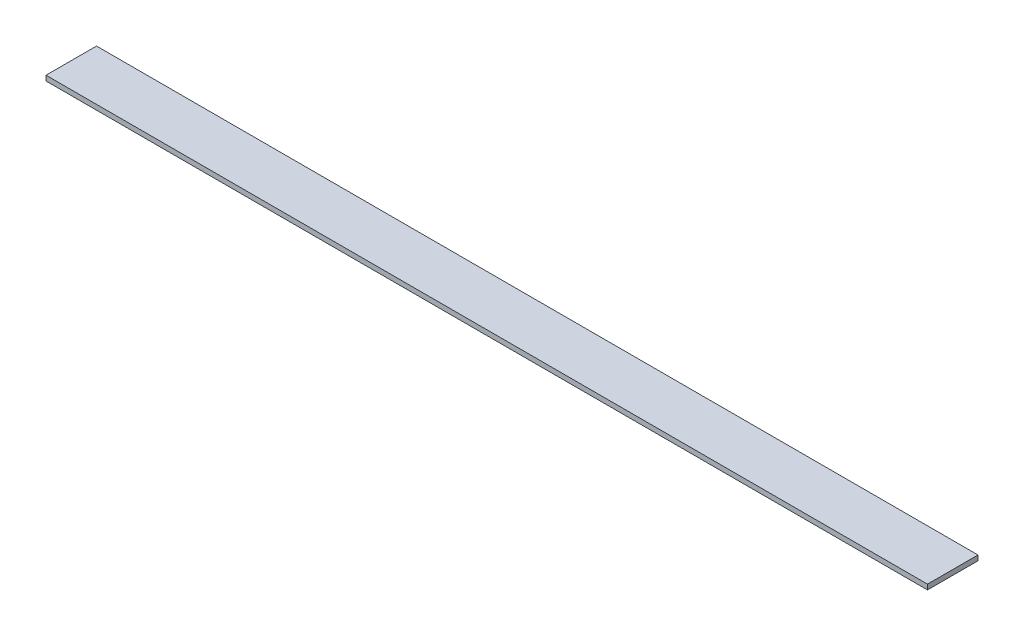
ISO-10303-21;
HEADER;
FILE_DESCRIPTION(('STEP AP214'),'2;1');
FILE_NAME('part.step','',(''),(''),'','','');
FILE_SCHEMA(('AUTOMOTIVE_DESIGN { 1 0 10303 214 1 1 1 1 }'));
ENDSEC;
DATA;
#1=APPLICATION_CONTEXT('core data for automotive mechanical design processes');
#2=APPLICATION_PROTOCOL_DEFINITION('international standard','automotive_design',2000,#1);
#3=PRODUCT_CONTEXT('',#1,'mechanical');
#4=PRODUCT('Part','Part','',(#3));
#5=PRODUCT_RELATED_PRODUCT_CATEGORY('part','',(#4));
#6=PRODUCT_DEFINITION_FORMATION('','',#4);
#7=PRODUCT_DEFINITION_CONTEXT('part definition',#1,'design');
#8=PRODUCT_DEFINITION('design','',#6,#7);
#9=PRODUCT_DEFINITION_SHAPE('','',#8);
#10=(LENGTH_UNIT() NAMED_UNIT(*) SI_UNIT(.MILLI.,.METRE.));
#11=(NAMED_UNIT(*) PLANE_ANGLE_UNIT() SI_UNIT($,.RADIAN.));
#12=(NAMED_UNIT(*) SI_UNIT($,.STERADIAN.) SOLID_ANGLE_UNIT());
#13=UNCERTAINTY_MEASURE_WITH_UNIT(LENGTH_MEASURE(1.E-05),#10,'distance_accuracy_value','');
#14=(GEOMETRIC_REPRESENTATION_CONTEXT(3) GLOBAL_UNCERTAINTY_ASSIGNED_CONTEXT((#13)) GLOBAL_UNIT_ASSIGNED_CONTEXT((#10,
#11,#12)) REPRESENTATION_CONTEXT('',''));
#15=CARTESIAN_POINT('',(0.,0.,0.));
#16=DIRECTION('',(0.,0.,1.));
#17=DIRECTION('',(1.,0.,0.));
#18=AXIS2_PLACEMENT_3D('',#15,#16,#17);
#19=CARTESIAN_POINT('',(443.23,0.,0.));
#20=DIRECTION('',(0.,0.,-1.));
#21=DIRECTION('',(-1.,0.,0.));
#22=AXIS2_PLACEMENT_3D('',#19,#20,#21);
#23=PLANE('',#22);
#24=DIRECTION('',(0.,-1.,0.));
#25=VECTOR('',#24,1.);
#26=CARTESIAN_POINT('',(0.,0.,0.));
#27=LINE('',#26,#25);
#28=CARTESIAN_POINT('',(0.,2.54,0.));
#29=VERTEX_POINT('',#28);
#30=CARTESIAN_POINT('',(0.,0.,0.));
#31=VERTEX_POINT('',#30);
#32=EDGE_CURVE('E97',#29,#31,#27,.T.);
#33=ORIENTED_EDGE('',*,*,#32,.T.);
#34=DIRECTION('',(-1.,0.,0.));
#35=VECTOR('',#34,1.);
#36=CARTESIAN_POINT('',(443.23,0.,0.));
#37=LINE('',#36,#35);
#38=CARTESIAN_POINT('',(443.23,0.,0.));
#39=VERTEX_POINT('',#38);
#40=EDGE_CURVE('E11',#39,#31,#37,.T.);
#41=ORIENTED_EDGE('',*,*,#40,.F.);
#42=DIRECTION('',(0.,-1.,0.));
#43=VECTOR('',#42,1.);
#44=CARTESIAN_POINT('',(443.23,0.,0.));
#45=LINE('',#44,#43);
#46=CARTESIAN_POINT('',(443.23,2.54,0.));
#47=VERTEX_POINT('',#46);
#48=EDGE_CURVE('E85',#47,#39,#45,.T.);
#49=ORIENTED_EDGE('',*,*,#48,.F.);
#50=DIRECTION('',(-1.,0.,0.));
#51=VECTOR('',#50,1.);
#52=CARTESIAN_POINT('',(443.23,2.54,0.));
#53=LINE('',#52,#51);
#54=EDGE_CURVE('E93',#47,#29,#53,.T.);
#55=ORIENTED_EDGE('',*,*,#54,.T.);
#56=EDGE_LOOP('',(#33,#41,#49,#55));
#57=FACE_BOUND('',#56,.T.);
#58=ADVANCED_FACE('F34',(#57),#23,.F.);
#59=CARTESIAN_POINT('',(443.23,0.,0.));
#60=DIRECTION('',(0.,1.,0.));
#61=DIRECTION('',(0.,0.,1.));
#62=AXIS2_PLACEMENT_3D('',#59,#60,#61);
#63=PLANE('',#62);
#64=DIRECTION('',(0.,0.,-1.));
#65=VECTOR('',#64,1.);
#66=CARTESIAN_POINT('',(0.,0.,0.));
#67=LINE('',#66,#65);
#68=CARTESIAN_POINT('',(0.,0.,-25.4));
#69=VERTEX_POINT('',#68);
#70=EDGE_CURVE('E89',#31,#69,#67,.T.);
#71=ORIENTED_EDGE('',*,*,#70,.T.);
#72=DIRECTION('',(-1.,0.,0.));
#73=VECTOR('',#72,1.);
#74=CARTESIAN_POINT('',(443.23,0.,-25.4));
#75=LINE('',#74,#73);
#76=CARTESIAN_POINT('',(443.23,0.,-25.4));
#77=VERTEX_POINT('',#76);
#78=EDGE_CURVE('E42',#77,#69,#75,.T.);
#79=ORIENTED_EDGE('',*,*,#78,.F.);
#80=DIRECTION('',(0.,0.,-1.));
#81=VECTOR('',#80,1.);
#82=CARTESIAN_POINT('',(443.23,0.,0.));
#83=LINE('',#82,#81);
#84=EDGE_CURVE('E80',#39,#77,#83,.T.);
#85=ORIENTED_EDGE('',*,*,#84,.F.);
#86=ORIENTED_EDGE('',*,*,#40,.T.);
#87=EDGE_LOOP('',(#71,#79,#85,#86));
#88=FACE_BOUND('',#87,.T.);
#89=ADVANCED_FACE('F88',(#88),#63,.F.);
#90=CARTESIAN_POINT('',(443.23,0.,-25.4));
#91=DIRECTION('',(0.,0.,1.));
#92=DIRECTION('',(1.,0.,0.));
#93=AXIS2_PLACEMENT_3D('',#90,#91,#92);
#94=PLANE('',#93);
#95=DIRECTION('',(0.,1.,0.));
#96=VECTOR('',#95,1.);
#97=CARTESIAN_POINT('',(0.,0.,-25.4));
#98=LINE('',#97,#96);
#99=CARTESIAN_POINT('',(0.,2.54,-25.4));
#100=VERTEX_POINT('',#99);
#101=EDGE_CURVE('E67',#69,#100,#98,.T.);
#102=ORIENTED_EDGE('',*,*,#101,.T.);
#103=DIRECTION('',(-1.,0.,0.));
#104=VECTOR('',#103,1.);
#105=CARTESIAN_POINT('',(443.23,2.54,-25.4));
#106=LINE('',#105,#104);
#107=CARTESIAN_POINT('',(443.23,2.54,-25.4));
#108=VERTEX_POINT('',#107);
#109=EDGE_CURVE('E90',#108,#100,#106,.T.);
#110=ORIENTED_EDGE('',*,*,#109,.F.);
#111=DIRECTION('',(0.,1.,0.));
#112=VECTOR('',#111,1.);
#113=CARTESIAN_POINT('',(443.23,0.,-25.4));
#114=LINE('',#113,#112);
#115=EDGE_CURVE('E83',#77,#108,#114,.T.);
#116=ORIENTED_EDGE('',*,*,#115,.F.);
#117=ORIENTED_EDGE('',*,*,#78,.T.);
#118=EDGE_LOOP('',(#102,#110,#116,#117));
#119=FACE_BOUND('',#118,.T.);
#120=ADVANCED_FACE('F91',(#119),#94,.F.);
#121=CARTESIAN_POINT('',(443.23,2.54,0.));
#122=DIRECTION('',(0.,-1.,0.));
#123=DIRECTION('',(0.,0.,-1.));
#124=AXIS2_PLACEMENT_3D('',#121,#122,#123);
#125=PLANE('',#124);
#126=DIRECTION('',(0.,0.,1.));
#127=VECTOR('',#126,1.);
#128=CARTESIAN_POINT('',(0.,2.54,0.));
#129=LINE('',#128,#127);
#130=EDGE_CURVE('E73',#100,#29,#129,.T.);
#131=ORIENTED_EDGE('',*,*,#130,.T.);
#132=ORIENTED_EDGE('',*,*,#54,.F.);
#133=DIRECTION('',(0.,0.,1.));
#134=VECTOR('',#133,1.);
#135=CARTESIAN_POINT('',(443.23,2.54,0.));
#136=LINE('',#135,#134);
#137=EDGE_CURVE('E50',#108,#47,#136,.T.);
#138=ORIENTED_EDGE('',*,*,#137,.F.);
#139=ORIENTED_EDGE('',*,*,#109,.T.);
#140=EDGE_LOOP('',(#131,#132,#138,#139));
#141=FACE_BOUND('',#140,.T.);
#142=ADVANCED_FACE('F104',(#141),#125,.F.);
#143=CARTESIAN_POINT('',(443.23,0.,0.));
#144=DIRECTION('',(-1.,0.,0.));
#145=DIRECTION('',(0.,0.,1.));
#146=AXIS2_PLACEMENT_3D('',#143,#144,#145);
#147=PLANE('',#146);
#148=ORIENTED_EDGE('',*,*,#48,.T.);
#149=ORIENTED_EDGE('',*,*,#84,.T.);
#150=ORIENTED_EDGE('',*,*,#115,.T.);
#151=ORIENTED_EDGE('',*,*,#137,.T.);
#152=EDGE_LOOP('',(#148,#149,#150,#151));
#153=FACE_BOUND('',#152,.T.);
#154=ADVANCED_FACE('F81',(#153),#147,.F.);
#155=CARTESIAN_POINT('',(0.,0.,0.));
#156=DIRECTION('',(-1.,0.,0.));
#157=DIRECTION('',(0.,0.,1.));
#158=AXIS2_PLACEMENT_3D('',#155,#156,#157);
#159=PLANE('',#158);
#160=ORIENTED_EDGE('',*,*,#32,.F.);
#161=ORIENTED_EDGE('',*,*,#130,.F.);
#162=ORIENTED_EDGE('',*,*,#101,.F.);
#163=ORIENTED_EDGE('',*,*,#70,.F.);
#164=EDGE_LOOP('',(#160,#161,#162,#163));
#165=FACE_BOUND('',#164,.T.);
#166=ADVANCED_FACE('F107',(#165),#159,.T.);
#167=CLOSED_SHELL('',(#58,#89,#120,#142,#154,#166));
#168=MANIFOLD_SOLID_BREP('B2',#167);
#169=ADVANCED_BREP_SHAPE_REPRESENTATION('',(#18,#168),#14);
#170=SHAPE_DEFINITION_REPRESENTATION(#9,#169);
ENDSEC;
END-ISO-10303-21;
